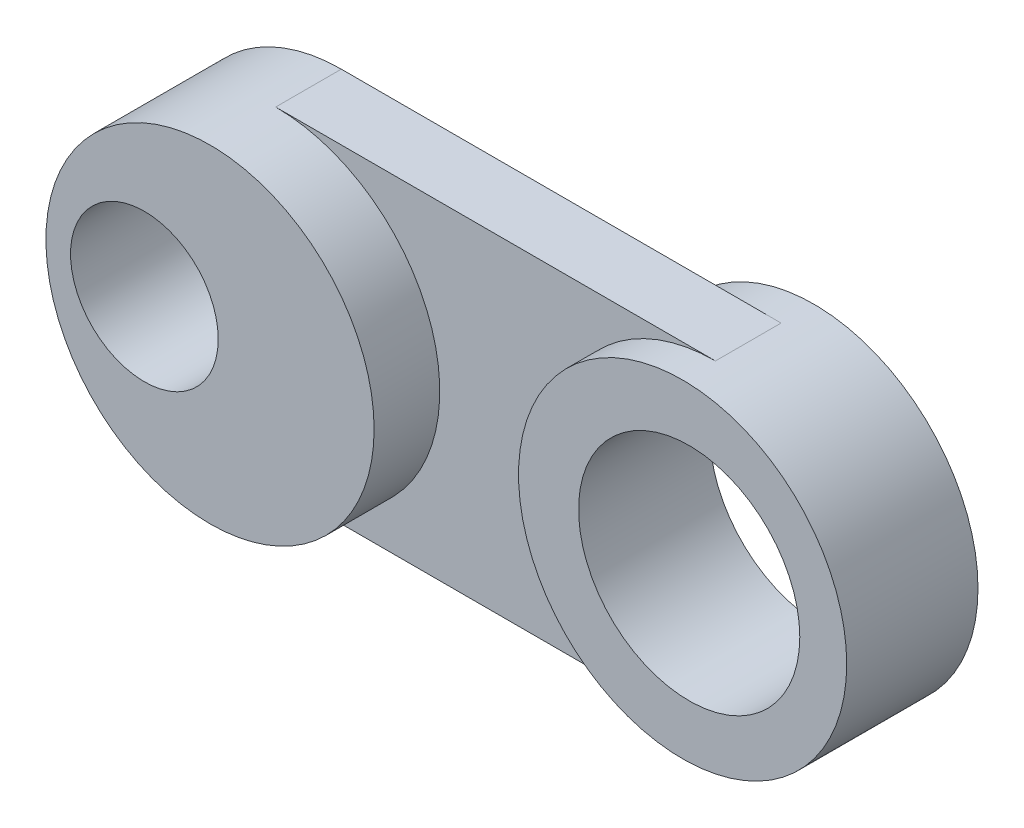
ISO-10303-21;
HEADER;
FILE_DESCRIPTION(('STEP AP214'),'2;1');
FILE_NAME('part.step','',(''),(''),'','','');
FILE_SCHEMA(('AUTOMOTIVE_DESIGN { 1 0 10303 214 1 1 1 1 }'));
ENDSEC;
DATA;
#1=APPLICATION_CONTEXT('core data for automotive mechanical design processes');
#2=APPLICATION_PROTOCOL_DEFINITION('international standard','automotive_design',2000,#1);
#3=PRODUCT_CONTEXT('',#1,'mechanical');
#4=PRODUCT('Part','Part','',(#3));
#5=PRODUCT_RELATED_PRODUCT_CATEGORY('part','',(#4));
#6=PRODUCT_DEFINITION_FORMATION('','',#4);
#7=PRODUCT_DEFINITION_CONTEXT('part definition',#1,'design');
#8=PRODUCT_DEFINITION('design','',#6,#7);
#9=PRODUCT_DEFINITION_SHAPE('','',#8);
#10=(LENGTH_UNIT() NAMED_UNIT(*) SI_UNIT(.MILLI.,.METRE.));
#11=(NAMED_UNIT(*) PLANE_ANGLE_UNIT() SI_UNIT($,.RADIAN.));
#12=(NAMED_UNIT(*) SI_UNIT($,.STERADIAN.) SOLID_ANGLE_UNIT());
#13=UNCERTAINTY_MEASURE_WITH_UNIT(LENGTH_MEASURE(1.E-05),#10,'distance_accuracy_value','');
#14=(GEOMETRIC_REPRESENTATION_CONTEXT(3) GLOBAL_UNCERTAINTY_ASSIGNED_CONTEXT((#13)) GLOBAL_UNIT_ASSIGNED_CONTEXT((#10,
#11,#12)) REPRESENTATION_CONTEXT('',''));
#15=CARTESIAN_POINT('',(0.,0.,0.));
#16=DIRECTION('',(0.,0.,1.));
#17=DIRECTION('',(1.,0.,0.));
#18=AXIS2_PLACEMENT_3D('',#15,#16,#17);
#19=CARTESIAN_POINT('',(0.,6.35,1.27));
#20=DIRECTION('',(0.,0.,-1.));
#21=DIRECTION('',(-1.,0.,0.));
#22=AXIS2_PLACEMENT_3D('',#19,#20,#21);
#23=PLANE('',#22);
#24=CARTESIAN_POINT('',(17.018,6.35,1.27));
#25=DIRECTION('',(0.,0.,-1.));
#26=DIRECTION('',(-1.,0.,0.));
#27=AXIS2_PLACEMENT_3D('',#24,#25,#26);
#28=CIRCLE('',#27,6.35);
#29=CARTESIAN_POINT('',(17.018,12.7,1.27));
#30=VERTEX_POINT('',#29);
#31=CARTESIAN_POINT('',(17.018,0.,1.27));
#32=VERTEX_POINT('',#31);
#33=EDGE_CURVE('E64',#30,#32,#28,.F.);
#34=ORIENTED_EDGE('',*,*,#33,.F.);
#35=DIRECTION('',(-1.,0.,0.));
#36=VECTOR('',#35,1.);
#37=CARTESIAN_POINT('',(0.,12.7,1.27));
#38=LINE('',#37,#36);
#39=CARTESIAN_POINT('',(0.,12.7,1.27));
#40=VERTEX_POINT('',#39);
#41=EDGE_CURVE('E102',#30,#40,#38,.T.);
#42=ORIENTED_EDGE('',*,*,#41,.T.);
#43=CARTESIAN_POINT('',(0.,6.35,1.27));
#44=DIRECTION('',(0.,0.,1.));
#45=DIRECTION('',(1.,0.,0.));
#46=AXIS2_PLACEMENT_3D('',#43,#44,#45);
#47=CIRCLE('',#46,6.35);
#48=CARTESIAN_POINT('',(0.,0.,1.27));
#49=VERTEX_POINT('',#48);
#50=EDGE_CURVE('E11',#49,#40,#47,.T.);
#51=ORIENTED_EDGE('',*,*,#50,.F.);
#52=DIRECTION('',(1.,0.,0.));
#53=VECTOR('',#52,1.);
#54=CARTESIAN_POINT('',(0.,0.,1.27));
#55=LINE('',#54,#53);
#56=EDGE_CURVE('E93',#49,#32,#55,.T.);
#57=ORIENTED_EDGE('',*,*,#56,.T.);
#58=EDGE_LOOP('',(#34,#42,#51,#57));
#59=FACE_BOUND('',#58,.T.);
#60=ADVANCED_FACE('F45',(#59),#23,.F.);
#61=CARTESIAN_POINT('',(0.,6.35,-1.27));
#62=DIRECTION('',(0.,0.,-1.));
#63=DIRECTION('',(-1.,0.,0.));
#64=AXIS2_PLACEMENT_3D('',#61,#62,#63);
#65=PLANE('',#64);
#66=CARTESIAN_POINT('',(-2.54,6.35,-1.27));
#67=DIRECTION('',(0.,0.,1.));
#68=DIRECTION('',(1.,0.,0.));
#69=AXIS2_PLACEMENT_3D('',#66,#67,#68);
#70=CIRCLE('',#69,2.8575);
#71=CARTESIAN_POINT('',(0.3175,6.35,-1.27));
#72=VERTEX_POINT('',#71);
#73=EDGE_CURVE('E107',#72,#72,#70,.T.);
#74=ORIENTED_EDGE('',*,*,#73,.T.);
#75=EDGE_LOOP('',(#74));
#76=FACE_BOUND('',#75,.T.);
#77=DIRECTION('',(-1.,0.,0.));
#78=VECTOR('',#77,1.);
#79=CARTESIAN_POINT('',(0.,12.7,-1.27));
#80=LINE('',#79,#78);
#81=CARTESIAN_POINT('',(17.018,12.7,-1.27));
#82=VERTEX_POINT('',#81);
#83=CARTESIAN_POINT('',(0.,12.7,-1.27));
#84=VERTEX_POINT('',#83);
#85=EDGE_CURVE('E84',#82,#84,#80,.T.);
#86=ORIENTED_EDGE('',*,*,#85,.F.);
#87=CARTESIAN_POINT('',(17.018,6.35,-1.27));
#88=DIRECTION('',(0.,0.,-1.));
#89=DIRECTION('',(-1.,0.,0.));
#90=AXIS2_PLACEMENT_3D('',#87,#88,#89);
#91=CIRCLE('',#90,6.35);
#92=CARTESIAN_POINT('',(17.018,0.,-1.27));
#93=VERTEX_POINT('',#92);
#94=EDGE_CURVE('E78',#82,#93,#91,.F.);
#95=ORIENTED_EDGE('',*,*,#94,.T.);
#96=DIRECTION('',(1.,0.,0.));
#97=VECTOR('',#96,1.);
#98=CARTESIAN_POINT('',(0.,0.,-1.27));
#99=LINE('',#98,#97);
#100=CARTESIAN_POINT('',(0.,0.,-1.27));
#101=VERTEX_POINT('',#100);
#102=EDGE_CURVE('E94',#101,#93,#99,.T.);
#103=ORIENTED_EDGE('',*,*,#102,.F.);
#104=CARTESIAN_POINT('',(0.,6.35,-1.27));
#105=DIRECTION('',(0.,0.,1.));
#106=DIRECTION('',(-1.,0.,0.));
#107=AXIS2_PLACEMENT_3D('',#104,#105,#106);
#108=CIRCLE('',#107,6.35);
#109=EDGE_CURVE('E100',#84,#101,#108,.T.);
#110=ORIENTED_EDGE('',*,*,#109,.F.);
#111=EDGE_LOOP('',(#86,#95,#103,#110));
#112=FACE_BOUND('',#111,.T.);
#113=ADVANCED_FACE('F104',(#76,#112),#65,.T.);
#114=CARTESIAN_POINT('',(0.,6.35,1.27));
#115=DIRECTION('',(0.,0.,-1.));
#116=DIRECTION('',(-1.,0.,0.));
#117=AXIS2_PLACEMENT_3D('',#114,#115,#116);
#118=CYLINDRICAL_SURFACE('',#117,6.35);
#119=ORIENTED_EDGE('',*,*,#109,.T.);
#120=DIRECTION('',(0.,0.,-1.));
#121=VECTOR('',#120,1.);
#122=CARTESIAN_POINT('',(0.,0.,1.27));
#123=LINE('',#122,#121);
#124=EDGE_CURVE('E49',#49,#101,#123,.T.);
#125=ORIENTED_EDGE('',*,*,#124,.F.);
#126=ORIENTED_EDGE('',*,*,#50,.T.);
#127=DIRECTION('',(0.,0.,-1.));
#128=VECTOR('',#127,1.);
#129=CARTESIAN_POINT('',(0.,12.7,1.27));
#130=LINE('',#129,#128);
#131=EDGE_CURVE('E88',#40,#84,#130,.T.);
#132=ORIENTED_EDGE('',*,*,#131,.T.);
#133=EDGE_LOOP('',(#119,#125,#126,#132));
#134=FACE_BOUND('',#133,.T.);
#135=CARTESIAN_POINT('',(0.,6.35,3.81));
#136=DIRECTION('',(0.,0.,1.));
#137=DIRECTION('',(1.,0.,0.));
#138=AXIS2_PLACEMENT_3D('',#135,#136,#137);
#139=CIRCLE('',#138,6.35);
#140=CARTESIAN_POINT('',(6.35,6.35,3.81));
#141=VERTEX_POINT('',#140);
#142=EDGE_CURVE('E113',#141,#141,#139,.T.);
#143=ORIENTED_EDGE('',*,*,#142,.F.);
#144=EDGE_LOOP('',(#143));
#145=FACE_BOUND('',#144,.T.);
#146=ADVANCED_FACE('F47',(#134,#145),#118,.T.);
#147=CARTESIAN_POINT('',(0.,0.,1.27));
#148=DIRECTION('',(0.,1.,0.));
#149=DIRECTION('',(-1.,0.,0.));
#150=AXIS2_PLACEMENT_3D('',#147,#148,#149);
#151=PLANE('',#150);
#152=ORIENTED_EDGE('',*,*,#102,.T.);
#153=DIRECTION('',(0.,0.,-1.));
#154=VECTOR('',#153,1.);
#155=CARTESIAN_POINT('',(17.018,0.,1.27));
#156=LINE('',#155,#154);
#157=EDGE_CURVE('E119',#32,#93,#156,.T.);
#158=ORIENTED_EDGE('',*,*,#157,.F.);
#159=ORIENTED_EDGE('',*,*,#56,.F.);
#160=ORIENTED_EDGE('',*,*,#124,.T.);
#161=EDGE_LOOP('',(#152,#158,#159,#160));
#162=FACE_BOUND('',#161,.T.);
#163=ADVANCED_FACE('F127',(#162),#151,.F.);
#164=CARTESIAN_POINT('',(17.018,6.35,1.27));
#165=DIRECTION('',(0.,0.,-1.));
#166=DIRECTION('',(-1.,0.,0.));
#167=AXIS2_PLACEMENT_3D('',#164,#165,#166);
#168=CYLINDRICAL_SURFACE('',#167,6.35);
#169=ORIENTED_EDGE('',*,*,#157,.T.);
#170=ORIENTED_EDGE('',*,*,#94,.F.);
#171=DIRECTION('',(0.,0.,-1.));
#172=VECTOR('',#171,1.);
#173=CARTESIAN_POINT('',(17.018,12.7,1.27));
#174=LINE('',#173,#172);
#175=EDGE_CURVE('E90',#30,#82,#174,.T.);
#176=ORIENTED_EDGE('',*,*,#175,.F.);
#177=ORIENTED_EDGE('',*,*,#33,.T.);
#178=EDGE_LOOP('',(#169,#170,#176,#177));
#179=FACE_BOUND('',#178,.T.);
#180=CARTESIAN_POINT('',(17.018,6.35,-2.54));
#181=DIRECTION('',(0.,0.,1.));
#182=DIRECTION('',(1.,0.,0.));
#183=AXIS2_PLACEMENT_3D('',#180,#181,#182);
#184=CIRCLE('',#183,6.35);
#185=CARTESIAN_POINT('',(23.368,6.35,-2.54));
#186=VERTEX_POINT('',#185);
#187=EDGE_CURVE('E144',#186,#186,#184,.T.);
#188=ORIENTED_EDGE('',*,*,#187,.T.);
#189=EDGE_LOOP('',(#188));
#190=FACE_BOUND('',#189,.T.);
#191=CARTESIAN_POINT('',(17.018,6.35,2.54));
#192=DIRECTION('',(0.,0.,1.));
#193=DIRECTION('',(1.,0.,0.));
#194=AXIS2_PLACEMENT_3D('',#191,#192,#193);
#195=CIRCLE('',#194,6.35);
#196=CARTESIAN_POINT('',(23.368,6.35,2.54));
#197=VERTEX_POINT('',#196);
#198=EDGE_CURVE('E143',#197,#197,#195,.T.);
#199=ORIENTED_EDGE('',*,*,#198,.F.);
#200=EDGE_LOOP('',(#199));
#201=FACE_BOUND('',#200,.T.);
#202=ADVANCED_FACE('F185',(#179,#190,#201),#168,.T.);
#203=CARTESIAN_POINT('',(0.,12.7,1.27));
#204=DIRECTION('',(0.,-1.,0.));
#205=DIRECTION('',(1.,0.,0.));
#206=AXIS2_PLACEMENT_3D('',#203,#204,#205);
#207=PLANE('',#206);
#208=ORIENTED_EDGE('',*,*,#85,.T.);
#209=ORIENTED_EDGE('',*,*,#131,.F.);
#210=ORIENTED_EDGE('',*,*,#41,.F.);
#211=ORIENTED_EDGE('',*,*,#175,.T.);
#212=EDGE_LOOP('',(#208,#209,#210,#211));
#213=FACE_BOUND('',#212,.T.);
#214=ADVANCED_FACE('F86',(#213),#207,.F.);
#215=CARTESIAN_POINT('',(-2.54,6.35,1.27));
#216=DIRECTION('',(0.,0.,-1.));
#217=DIRECTION('',(-1.,0.,0.));
#218=AXIS2_PLACEMENT_3D('',#215,#216,#217);
#219=CYLINDRICAL_SURFACE('',#218,2.8575);
#220=ORIENTED_EDGE('',*,*,#73,.F.);
#221=EDGE_LOOP('',(#220));
#222=FACE_BOUND('',#221,.T.);
#223=CARTESIAN_POINT('',(-2.54,6.35,3.81));
#224=DIRECTION('',(0.,0.,1.));
#225=DIRECTION('',(1.,0.,0.));
#226=AXIS2_PLACEMENT_3D('',#223,#224,#225);
#227=CIRCLE('',#226,2.8575);
#228=CARTESIAN_POINT('',(0.3175,6.35,3.81));
#229=VERTEX_POINT('',#228);
#230=EDGE_CURVE('E135',#229,#229,#227,.F.);
#231=ORIENTED_EDGE('',*,*,#230,.F.);
#232=EDGE_LOOP('',(#231));
#233=FACE_BOUND('',#232,.T.);
#234=ADVANCED_FACE('F184',(#222,#233),#219,.F.);
#235=CARTESIAN_POINT('',(0.,0.,3.81));
#236=DIRECTION('',(0.,0.,1.));
#237=DIRECTION('',(1.,0.,0.));
#238=AXIS2_PLACEMENT_3D('',#235,#236,#237);
#239=PLANE('',#238);
#240=ORIENTED_EDGE('',*,*,#230,.T.);
#241=EDGE_LOOP('',(#240));
#242=FACE_BOUND('',#241,.T.);
#243=ORIENTED_EDGE('',*,*,#142,.T.);
#244=EDGE_LOOP('',(#243));
#245=FACE_BOUND('',#244,.T.);
#246=ADVANCED_FACE('F232',(#242,#245),#239,.T.);
#247=CARTESIAN_POINT('',(17.018,6.35,-2.54));
#248=DIRECTION('',(0.,0.,1.));
#249=DIRECTION('',(1.,0.,0.));
#250=AXIS2_PLACEMENT_3D('',#247,#248,#249);
#251=PLANE('',#250);
#252=ORIENTED_EDGE('',*,*,#187,.F.);
#253=EDGE_LOOP('',(#252));
#254=FACE_BOUND('',#253,.T.);
#255=CARTESIAN_POINT('',(17.272,6.35,-2.54));
#256=DIRECTION('',(0.,0.,1.));
#257=DIRECTION('',(1.,0.,0.));
#258=AXIS2_PLACEMENT_3D('',#255,#256,#257);
#259=CIRCLE('',#258,4.2799);
#260=CARTESIAN_POINT('',(21.5519,6.35,-2.54));
#261=VERTEX_POINT('',#260);
#262=EDGE_CURVE('E152',#261,#261,#259,.T.);
#263=ORIENTED_EDGE('',*,*,#262,.T.);
#264=EDGE_LOOP('',(#263));
#265=FACE_BOUND('',#264,.T.);
#266=ADVANCED_FACE('F169',(#254,#265),#251,.F.);
#267=CARTESIAN_POINT('',(17.272,6.35,1.27));
#268=DIRECTION('',(0.,0.,-1.));
#269=DIRECTION('',(-1.,0.,0.));
#270=AXIS2_PLACEMENT_3D('',#267,#268,#269);
#271=CYLINDRICAL_SURFACE('',#270,4.2799);
#272=ORIENTED_EDGE('',*,*,#262,.F.);
#273=EDGE_LOOP('',(#272));
#274=FACE_BOUND('',#273,.T.);
#275=CARTESIAN_POINT('',(17.272,6.35,2.54));
#276=DIRECTION('',(0.,0.,1.));
#277=DIRECTION('',(1.,0.,0.));
#278=AXIS2_PLACEMENT_3D('',#275,#276,#277);
#279=CIRCLE('',#278,4.2799);
#280=CARTESIAN_POINT('',(21.5519,6.35,2.54));
#281=VERTEX_POINT('',#280);
#282=EDGE_CURVE('E148',#281,#281,#279,.T.);
#283=ORIENTED_EDGE('',*,*,#282,.T.);
#284=EDGE_LOOP('',(#283));
#285=FACE_BOUND('',#284,.T.);
#286=ADVANCED_FACE('F160',(#274,#285),#271,.F.);
#287=CARTESIAN_POINT('',(17.018,6.35,2.54));
#288=DIRECTION('',(0.,0.,1.));
#289=DIRECTION('',(1.,0.,0.));
#290=AXIS2_PLACEMENT_3D('',#287,#288,#289);
#291=PLANE('',#290);
#292=ORIENTED_EDGE('',*,*,#198,.T.);
#293=EDGE_LOOP('',(#292));
#294=FACE_BOUND('',#293,.T.);
#295=ORIENTED_EDGE('',*,*,#282,.F.);
#296=EDGE_LOOP('',(#295));
#297=FACE_BOUND('',#296,.T.);
#298=ADVANCED_FACE('F162',(#294,#297),#291,.T.);
#299=CLOSED_SHELL('',(#60,#113,#146,#163,#202,#214,#234,#246,#266,#286,#298));
#300=MANIFOLD_SOLID_BREP('B2',#299);
#301=ADVANCED_BREP_SHAPE_REPRESENTATION('',(#18,#300),#14);
#302=SHAPE_DEFINITION_REPRESENTATION(#9,#301);
ENDSEC;
END-ISO-10303-21;
